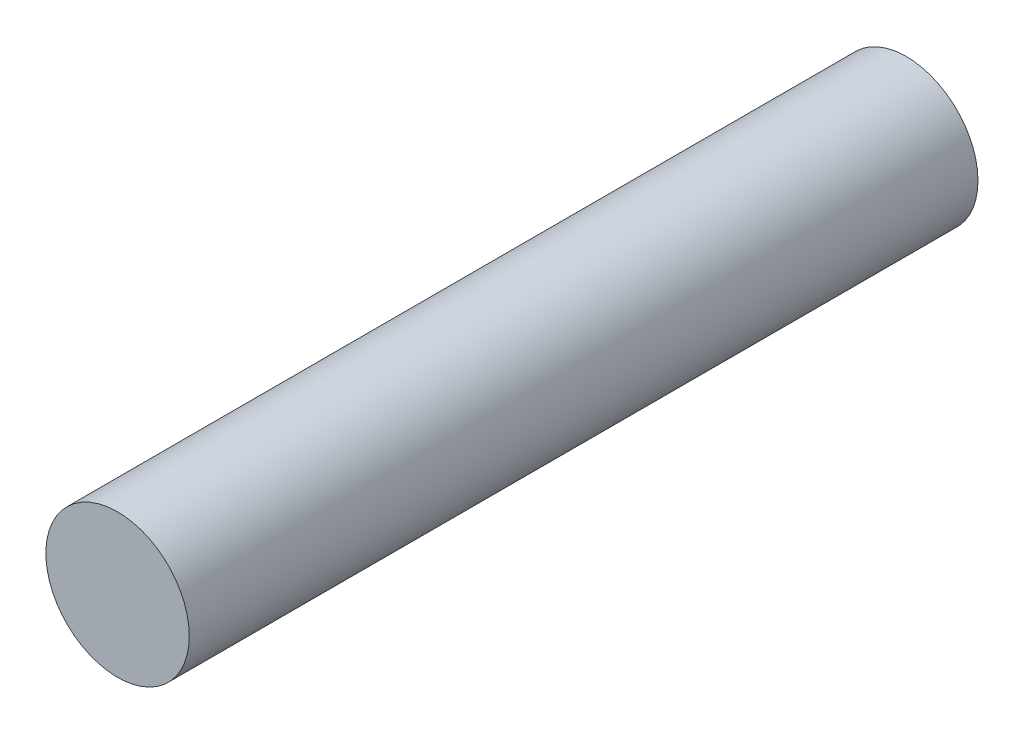
ISO-10303-21;
HEADER;
FILE_DESCRIPTION(('STEP AP214'),'2;1');
FILE_NAME('part.step','',(''),(''),'','','');
FILE_SCHEMA(('AUTOMOTIVE_DESIGN { 1 0 10303 214 1 1 1 1 }'));
ENDSEC;
DATA;
#1=APPLICATION_CONTEXT('core data for automotive mechanical design processes');
#2=APPLICATION_PROTOCOL_DEFINITION('international standard','automotive_design',2000,#1);
#3=PRODUCT_CONTEXT('',#1,'mechanical');
#4=PRODUCT('Part','Part','',(#3));
#5=PRODUCT_RELATED_PRODUCT_CATEGORY('part','',(#4));
#6=PRODUCT_DEFINITION_FORMATION('','',#4);
#7=PRODUCT_DEFINITION_CONTEXT('part definition',#1,'design');
#8=PRODUCT_DEFINITION('design','',#6,#7);
#9=PRODUCT_DEFINITION_SHAPE('','',#8);
#10=(LENGTH_UNIT() NAMED_UNIT(*) SI_UNIT(.MILLI.,.METRE.));
#11=(NAMED_UNIT(*) PLANE_ANGLE_UNIT() SI_UNIT($,.RADIAN.));
#12=(NAMED_UNIT(*) SI_UNIT($,.STERADIAN.) SOLID_ANGLE_UNIT());
#13=UNCERTAINTY_MEASURE_WITH_UNIT(LENGTH_MEASURE(1.E-05),#10,'distance_accuracy_value','');
#14=(GEOMETRIC_REPRESENTATION_CONTEXT(3) GLOBAL_UNCERTAINTY_ASSIGNED_CONTEXT((#13)) GLOBAL_UNIT_ASSIGNED_CONTEXT((#10,
#11,#12)) REPRESENTATION_CONTEXT('',''));
#15=CARTESIAN_POINT('',(0.,0.,0.));
#16=DIRECTION('',(0.,0.,1.));
#17=DIRECTION('',(1.,0.,0.));
#18=AXIS2_PLACEMENT_3D('',#15,#16,#17);
#19=CARTESIAN_POINT('',(-4.06866735603368,4.06866735603368,55.));
#20=DIRECTION('',(0.,0.,-1.));
#21=DIRECTION('',(-1.,0.,0.));
#22=AXIS2_PLACEMENT_3D('',#19,#20,#21);
#23=CYLINDRICAL_SURFACE('',#22,5.);
#24=CARTESIAN_POINT('',(-4.06866735603368,4.06866735603368,55.));
#25=DIRECTION('',(0.,0.,1.));
#26=DIRECTION('',(1.,0.,0.));
#27=AXIS2_PLACEMENT_3D('',#24,#25,#26);
#28=CIRCLE('',#27,5.);
#29=CARTESIAN_POINT('',(0.93133264396632,4.06866735603368,55.));
#30=VERTEX_POINT('',#29);
#31=EDGE_CURVE('E10',#30,#30,#28,.T.);
#32=ORIENTED_EDGE('',*,*,#31,.F.);
#33=EDGE_LOOP('',(#32));
#34=FACE_BOUND('',#33,.T.);
#35=CARTESIAN_POINT('',(-4.06866735603368,4.06866735603368,0.));
#36=DIRECTION('',(0.,0.,1.));
#37=DIRECTION('',(1.,0.,0.));
#38=AXIS2_PLACEMENT_3D('',#35,#36,#37);
#39=CIRCLE('',#38,5.);
#40=CARTESIAN_POINT('',(0.93133264396632,4.06866735603368,0.));
#41=VERTEX_POINT('',#40);
#42=EDGE_CURVE('E46',#41,#41,#39,.T.);
#43=ORIENTED_EDGE('',*,*,#42,.T.);
#44=EDGE_LOOP('',(#43));
#45=FACE_BOUND('',#44,.T.);
#46=ADVANCED_FACE('F43',(#34,#45),#23,.T.);
#47=CARTESIAN_POINT('',(-4.06866735603368,4.06866735603368,55.));
#48=DIRECTION('',(0.,0.,1.));
#49=DIRECTION('',(1.,0.,0.));
#50=AXIS2_PLACEMENT_3D('',#47,#48,#49);
#51=PLANE('',#50);
#52=ORIENTED_EDGE('',*,*,#31,.T.);
#53=EDGE_LOOP('',(#52));
#54=FACE_BOUND('',#53,.T.);
#55=ADVANCED_FACE('F60',(#54),#51,.T.);
#56=CARTESIAN_POINT('',(-4.06866735603368,4.06866735603368,0.));
#57=DIRECTION('',(0.,0.,1.));
#58=DIRECTION('',(1.,0.,0.));
#59=AXIS2_PLACEMENT_3D('',#56,#57,#58);
#60=PLANE('',#59);
#61=ORIENTED_EDGE('',*,*,#42,.F.);
#62=EDGE_LOOP('',(#61));
#63=FACE_BOUND('',#62,.T.);
#64=ADVANCED_FACE('F58',(#63),#60,.F.);
#65=CLOSED_SHELL('',(#46,#55,#64));
#66=MANIFOLD_SOLID_BREP('B2',#65);
#67=ADVANCED_BREP_SHAPE_REPRESENTATION('',(#18,#66),#14);
#68=SHAPE_DEFINITION_REPRESENTATION(#9,#67);
ENDSEC;
END-ISO-10303-21;
